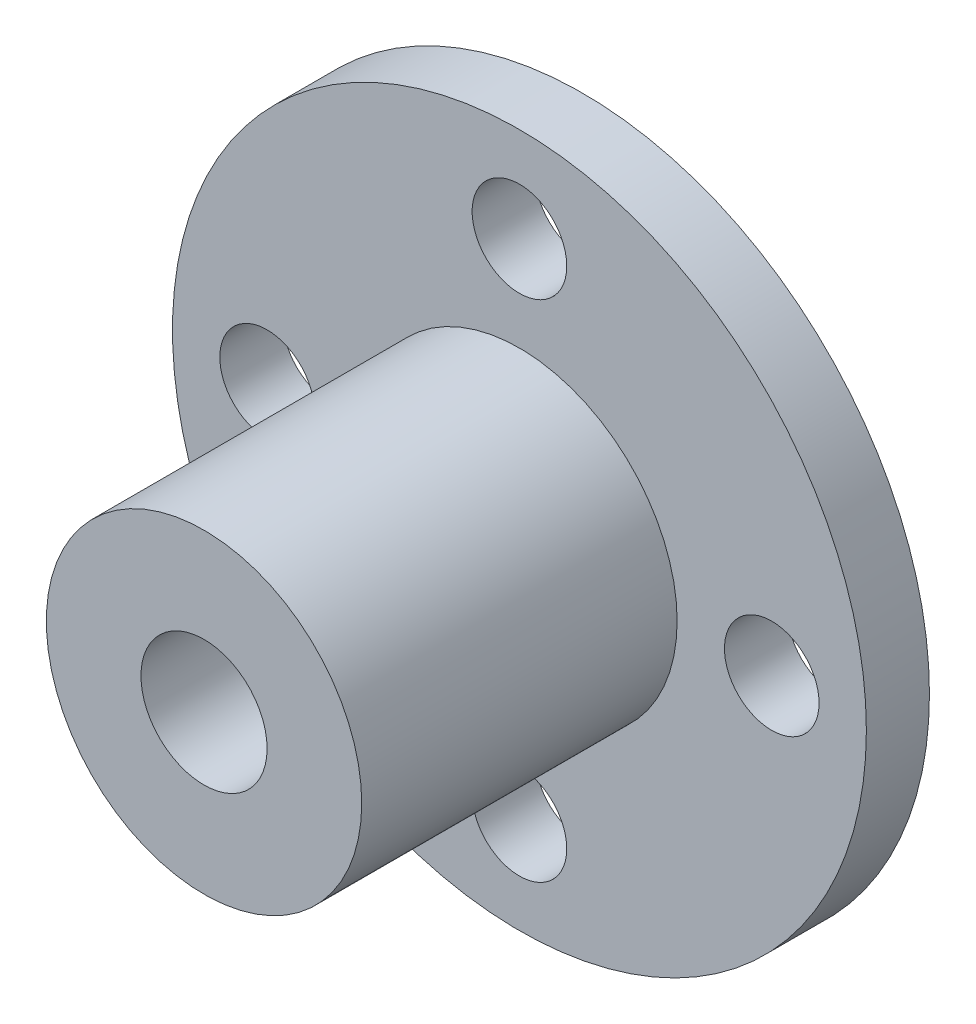
ISO-10303-21;
HEADER;
FILE_DESCRIPTION(('STEP AP214'),'2;1');
FILE_NAME('part.step','',(''),(''),'','','');
FILE_SCHEMA(('AUTOMOTIVE_DESIGN { 1 0 10303 214 1 1 1 1 }'));
ENDSEC;
DATA;
#1=APPLICATION_CONTEXT('core data for automotive mechanical design processes');
#2=APPLICATION_PROTOCOL_DEFINITION('international standard','automotive_design',2000,#1);
#3=PRODUCT_CONTEXT('',#1,'mechanical');
#4=PRODUCT('Part','Part','',(#3));
#5=PRODUCT_RELATED_PRODUCT_CATEGORY('part','',(#4));
#6=PRODUCT_DEFINITION_FORMATION('','',#4);
#7=PRODUCT_DEFINITION_CONTEXT('part definition',#1,'design');
#8=PRODUCT_DEFINITION('design','',#6,#7);
#9=PRODUCT_DEFINITION_SHAPE('','',#8);
#10=(LENGTH_UNIT() NAMED_UNIT(*) SI_UNIT(.MILLI.,.METRE.));
#11=(NAMED_UNIT(*) PLANE_ANGLE_UNIT() SI_UNIT($,.RADIAN.));
#12=(NAMED_UNIT(*) SI_UNIT($,.STERADIAN.) SOLID_ANGLE_UNIT());
#13=UNCERTAINTY_MEASURE_WITH_UNIT(LENGTH_MEASURE(1.E-05),#10,'distance_accuracy_value','');
#14=(GEOMETRIC_REPRESENTATION_CONTEXT(3) GLOBAL_UNCERTAINTY_ASSIGNED_CONTEXT((#13)) GLOBAL_UNIT_ASSIGNED_CONTEXT((#10,
#11,#12)) REPRESENTATION_CONTEXT('',''));
#15=CARTESIAN_POINT('',(0.,0.,0.));
#16=DIRECTION('',(0.,0.,1.));
#17=DIRECTION('',(1.,0.,0.));
#18=AXIS2_PLACEMENT_3D('',#15,#16,#17);
#19=CARTESIAN_POINT('',(0.,8.,2.));
#20=DIRECTION('',(0.,0.,-1.));
#21=DIRECTION('',(-1.,0.,0.));
#22=AXIS2_PLACEMENT_3D('',#19,#20,#21);
#23=CYLINDRICAL_SURFACE('',#22,1.5);
#24=CARTESIAN_POINT('',(0.,8.,2.));
#25=DIRECTION('',(0.,0.,1.));
#26=DIRECTION('',(1.,0.,0.));
#27=AXIS2_PLACEMENT_3D('',#24,#25,#26);
#28=CIRCLE('',#27,1.5);
#29=CARTESIAN_POINT('',(1.5,8.,2.));
#30=VERTEX_POINT('',#29);
#31=EDGE_CURVE('E47',#30,#30,#28,.T.);
#32=ORIENTED_EDGE('',*,*,#31,.T.);
#33=EDGE_LOOP('',(#32));
#34=FACE_BOUND('',#33,.T.);
#35=CARTESIAN_POINT('',(0.,8.,0.));
#36=DIRECTION('',(0.,0.,1.));
#37=DIRECTION('',(1.,0.,0.));
#38=AXIS2_PLACEMENT_3D('',#35,#36,#37);
#39=CIRCLE('',#38,1.5);
#40=CARTESIAN_POINT('',(1.5,8.,0.));
#41=VERTEX_POINT('',#40);
#42=EDGE_CURVE('E60',#41,#41,#39,.T.);
#43=ORIENTED_EDGE('',*,*,#42,.F.);
#44=EDGE_LOOP('',(#43));
#45=FACE_BOUND('',#44,.T.);
#46=ADVANCED_FACE('F34',(#34,#45),#23,.F.);
#47=CARTESIAN_POINT('',(8.,0.,2.));
#48=DIRECTION('',(0.,0.,-1.));
#49=DIRECTION('',(-1.,0.,0.));
#50=AXIS2_PLACEMENT_3D('',#47,#48,#49);
#51=CYLINDRICAL_SURFACE('',#50,1.5);
#52=CARTESIAN_POINT('',(8.,0.,2.));
#53=DIRECTION('',(0.,0.,1.));
#54=DIRECTION('',(1.,0.,0.));
#55=AXIS2_PLACEMENT_3D('',#52,#53,#54);
#56=CIRCLE('',#55,1.5);
#57=CARTESIAN_POINT('',(9.5,0.,2.));
#58=VERTEX_POINT('',#57);
#59=EDGE_CURVE('E74',#58,#58,#56,.T.);
#60=ORIENTED_EDGE('',*,*,#59,.T.);
#61=EDGE_LOOP('',(#60));
#62=FACE_BOUND('',#61,.T.);
#63=CARTESIAN_POINT('',(8.,0.,0.));
#64=DIRECTION('',(0.,0.,1.));
#65=DIRECTION('',(1.,0.,0.));
#66=AXIS2_PLACEMENT_3D('',#63,#64,#65);
#67=CIRCLE('',#66,1.5);
#68=CARTESIAN_POINT('',(9.5,0.,0.));
#69=VERTEX_POINT('',#68);
#70=EDGE_CURVE('E58',#69,#69,#67,.T.);
#71=ORIENTED_EDGE('',*,*,#70,.F.);
#72=EDGE_LOOP('',(#71));
#73=FACE_BOUND('',#72,.T.);
#74=ADVANCED_FACE('F121',(#62,#73),#51,.F.);
#75=CARTESIAN_POINT('',(0.,-8.,2.));
#76=DIRECTION('',(0.,0.,-1.));
#77=DIRECTION('',(-1.,0.,0.));
#78=AXIS2_PLACEMENT_3D('',#75,#76,#77);
#79=CYLINDRICAL_SURFACE('',#78,1.5);
#80=CARTESIAN_POINT('',(0.,-8.,2.));
#81=DIRECTION('',(0.,0.,1.));
#82=DIRECTION('',(1.,0.,0.));
#83=AXIS2_PLACEMENT_3D('',#80,#81,#82);
#84=CIRCLE('',#83,1.5);
#85=CARTESIAN_POINT('',(1.5,-8.,2.));
#86=VERTEX_POINT('',#85);
#87=EDGE_CURVE('E69',#86,#86,#84,.T.);
#88=ORIENTED_EDGE('',*,*,#87,.T.);
#89=EDGE_LOOP('',(#88));
#90=FACE_BOUND('',#89,.T.);
#91=CARTESIAN_POINT('',(0.,-8.,0.));
#92=DIRECTION('',(0.,0.,1.));
#93=DIRECTION('',(1.,0.,0.));
#94=AXIS2_PLACEMENT_3D('',#91,#92,#93);
#95=CIRCLE('',#94,1.5);
#96=CARTESIAN_POINT('',(1.5,-8.,0.));
#97=VERTEX_POINT('',#96);
#98=EDGE_CURVE('E54',#97,#97,#95,.T.);
#99=ORIENTED_EDGE('',*,*,#98,.F.);
#100=EDGE_LOOP('',(#99));
#101=FACE_BOUND('',#100,.T.);
#102=ADVANCED_FACE('F126',(#90,#101),#79,.F.);
#103=CARTESIAN_POINT('',(-8.,0.,2.));
#104=DIRECTION('',(0.,0.,-1.));
#105=DIRECTION('',(-1.,0.,0.));
#106=AXIS2_PLACEMENT_3D('',#103,#104,#105);
#107=CYLINDRICAL_SURFACE('',#106,1.5);
#108=CARTESIAN_POINT('',(-8.,0.,2.));
#109=DIRECTION('',(0.,0.,1.));
#110=DIRECTION('',(1.,0.,0.));
#111=AXIS2_PLACEMENT_3D('',#108,#109,#110);
#112=CIRCLE('',#111,1.5);
#113=CARTESIAN_POINT('',(-6.5,0.,2.));
#114=VERTEX_POINT('',#113);
#115=EDGE_CURVE('E65',#114,#114,#112,.T.);
#116=ORIENTED_EDGE('',*,*,#115,.T.);
#117=EDGE_LOOP('',(#116));
#118=FACE_BOUND('',#117,.T.);
#119=CARTESIAN_POINT('',(-8.,0.,0.));
#120=DIRECTION('',(0.,0.,1.));
#121=DIRECTION('',(1.,0.,0.));
#122=AXIS2_PLACEMENT_3D('',#119,#120,#121);
#123=CIRCLE('',#122,1.5);
#124=CARTESIAN_POINT('',(-6.5,0.,0.));
#125=VERTEX_POINT('',#124);
#126=EDGE_CURVE('E51',#125,#125,#123,.T.);
#127=ORIENTED_EDGE('',*,*,#126,.F.);
#128=EDGE_LOOP('',(#127));
#129=FACE_BOUND('',#128,.T.);
#130=ADVANCED_FACE('F36',(#118,#129),#107,.F.);
#131=CARTESIAN_POINT('',(0.,0.,2.));
#132=DIRECTION('',(0.,0.,-1.));
#133=DIRECTION('',(-1.,0.,0.));
#134=AXIS2_PLACEMENT_3D('',#131,#132,#133);
#135=CYLINDRICAL_SURFACE('',#134,11.);
#136=CARTESIAN_POINT('',(0.,0.,2.));
#137=DIRECTION('',(0.,0.,1.));
#138=DIRECTION('',(1.,0.,0.));
#139=AXIS2_PLACEMENT_3D('',#136,#137,#138);
#140=CIRCLE('',#139,11.);
#141=CARTESIAN_POINT('',(11.,0.,2.));
#142=VERTEX_POINT('',#141);
#143=EDGE_CURVE('E10',#142,#142,#140,.T.);
#144=ORIENTED_EDGE('',*,*,#143,.F.);
#145=EDGE_LOOP('',(#144));
#146=FACE_BOUND('',#145,.T.);
#147=CARTESIAN_POINT('',(0.,0.,0.));
#148=DIRECTION('',(0.,0.,1.));
#149=DIRECTION('',(1.,0.,0.));
#150=AXIS2_PLACEMENT_3D('',#147,#148,#149);
#151=CIRCLE('',#150,11.);
#152=CARTESIAN_POINT('',(11.,0.,0.));
#153=VERTEX_POINT('',#152);
#154=EDGE_CURVE('E38',#153,#153,#151,.T.);
#155=ORIENTED_EDGE('',*,*,#154,.T.);
#156=EDGE_LOOP('',(#155));
#157=FACE_BOUND('',#156,.T.);
#158=ADVANCED_FACE('F90',(#146,#157),#135,.T.);
#159=CARTESIAN_POINT('',(0.,0.,2.));
#160=DIRECTION('',(0.,0.,1.));
#161=DIRECTION('',(1.,0.,0.));
#162=AXIS2_PLACEMENT_3D('',#159,#160,#161);
#163=PLANE('',#162);
#164=ORIENTED_EDGE('',*,*,#115,.F.);
#165=EDGE_LOOP('',(#164));
#166=FACE_BOUND('',#165,.T.);
#167=ORIENTED_EDGE('',*,*,#87,.F.);
#168=EDGE_LOOP('',(#167));
#169=FACE_BOUND('',#168,.T.);
#170=ORIENTED_EDGE('',*,*,#59,.F.);
#171=EDGE_LOOP('',(#170));
#172=FACE_BOUND('',#171,.T.);
#173=ORIENTED_EDGE('',*,*,#31,.F.);
#174=EDGE_LOOP('',(#173));
#175=FACE_BOUND('',#174,.T.);
#176=CARTESIAN_POINT('',(0.,0.,2.));
#177=DIRECTION('',(0.,0.,1.));
#178=DIRECTION('',(1.,0.,0.));
#179=AXIS2_PLACEMENT_3D('',#176,#177,#178);
#180=CIRCLE('',#179,5.);
#181=CARTESIAN_POINT('',(5.,0.,2.));
#182=VERTEX_POINT('',#181);
#183=EDGE_CURVE('E42',#182,#182,#180,.T.);
#184=ORIENTED_EDGE('',*,*,#183,.F.);
#185=EDGE_LOOP('',(#184));
#186=FACE_BOUND('',#185,.T.);
#187=ORIENTED_EDGE('',*,*,#143,.T.);
#188=EDGE_LOOP('',(#187));
#189=FACE_BOUND('',#188,.T.);
#190=ADVANCED_FACE('F86',(#166,#169,#172,#175,#186,#189),#163,.T.);
#191=CARTESIAN_POINT('',(0.,0.,0.));
#192=DIRECTION('',(0.,0.,1.));
#193=DIRECTION('',(1.,0.,0.));
#194=AXIS2_PLACEMENT_3D('',#191,#192,#193);
#195=PLANE('',#194);
#196=ORIENTED_EDGE('',*,*,#126,.T.);
#197=EDGE_LOOP('',(#196));
#198=FACE_BOUND('',#197,.T.);
#199=ORIENTED_EDGE('',*,*,#98,.T.);
#200=EDGE_LOOP('',(#199));
#201=FACE_BOUND('',#200,.T.);
#202=ORIENTED_EDGE('',*,*,#70,.T.);
#203=EDGE_LOOP('',(#202));
#204=FACE_BOUND('',#203,.T.);
#205=ORIENTED_EDGE('',*,*,#42,.T.);
#206=EDGE_LOOP('',(#205));
#207=FACE_BOUND('',#206,.T.);
#208=ORIENTED_EDGE('',*,*,#154,.F.);
#209=EDGE_LOOP('',(#208));
#210=FACE_BOUND('',#209,.T.);
#211=CARTESIAN_POINT('',(0.,0.,0.));
#212=DIRECTION('',(0.,0.,1.));
#213=DIRECTION('',(1.,0.,0.));
#214=AXIS2_PLACEMENT_3D('',#211,#212,#213);
#215=CIRCLE('',#214,2.);
#216=CARTESIAN_POINT('',(2.,0.,0.));
#217=VERTEX_POINT('',#216);
#218=EDGE_CURVE('E77',#217,#217,#215,.T.);
#219=ORIENTED_EDGE('',*,*,#218,.T.);
#220=EDGE_LOOP('',(#219));
#221=FACE_BOUND('',#220,.T.);
#222=ADVANCED_FACE('F89',(#198,#201,#204,#207,#210,#221),#195,.F.);
#223=CARTESIAN_POINT('',(0.,0.,12.));
#224=DIRECTION('',(0.,0.,-1.));
#225=DIRECTION('',(-1.,0.,0.));
#226=AXIS2_PLACEMENT_3D('',#223,#224,#225);
#227=CYLINDRICAL_SURFACE('',#226,2.);
#228=CARTESIAN_POINT('',(0.,0.,12.));
#229=DIRECTION('',(0.,0.,1.));
#230=DIRECTION('',(1.,0.,0.));
#231=AXIS2_PLACEMENT_3D('',#228,#229,#230);
#232=CIRCLE('',#231,2.);
#233=CARTESIAN_POINT('',(2.,0.,12.));
#234=VERTEX_POINT('',#233);
#235=EDGE_CURVE('E104',#234,#234,#232,.T.);
#236=ORIENTED_EDGE('',*,*,#235,.T.);
#237=EDGE_LOOP('',(#236));
#238=FACE_BOUND('',#237,.T.);
#239=ORIENTED_EDGE('',*,*,#218,.F.);
#240=EDGE_LOOP('',(#239));
#241=FACE_BOUND('',#240,.T.);
#242=ADVANCED_FACE('F99',(#238,#241),#227,.F.);
#243=CARTESIAN_POINT('',(0.,0.,12.));
#244=DIRECTION('',(0.,0.,-1.));
#245=DIRECTION('',(-1.,0.,0.));
#246=AXIS2_PLACEMENT_3D('',#243,#244,#245);
#247=CYLINDRICAL_SURFACE('',#246,5.);
#248=ORIENTED_EDGE('',*,*,#183,.T.);
#249=EDGE_LOOP('',(#248));
#250=FACE_BOUND('',#249,.T.);
#251=CARTESIAN_POINT('',(0.,0.,12.));
#252=DIRECTION('',(0.,0.,1.));
#253=DIRECTION('',(1.,0.,0.));
#254=AXIS2_PLACEMENT_3D('',#251,#252,#253);
#255=CIRCLE('',#254,5.);
#256=CARTESIAN_POINT('',(5.,0.,12.));
#257=VERTEX_POINT('',#256);
#258=EDGE_CURVE('E55',#257,#257,#255,.T.);
#259=ORIENTED_EDGE('',*,*,#258,.F.);
#260=EDGE_LOOP('',(#259));
#261=FACE_BOUND('',#260,.T.);
#262=ADVANCED_FACE('F95',(#250,#261),#247,.T.);
#263=CARTESIAN_POINT('',(0.,0.,12.));
#264=DIRECTION('',(0.,0.,1.));
#265=DIRECTION('',(1.,0.,0.));
#266=AXIS2_PLACEMENT_3D('',#263,#264,#265);
#267=PLANE('',#266);
#268=ORIENTED_EDGE('',*,*,#235,.F.);
#269=EDGE_LOOP('',(#268));
#270=FACE_BOUND('',#269,.T.);
#271=ORIENTED_EDGE('',*,*,#258,.T.);
#272=EDGE_LOOP('',(#271));
#273=FACE_BOUND('',#272,.T.);
#274=ADVANCED_FACE('F98',(#270,#273),#267,.T.);
#275=CLOSED_SHELL('',(#46,#74,#102,#130,#158,#190,#222,#242,#262,#274));
#276=MANIFOLD_SOLID_BREP('B2',#275);
#277=ADVANCED_BREP_SHAPE_REPRESENTATION('',(#18,#276),#14);
#278=SHAPE_DEFINITION_REPRESENTATION(#9,#277);
ENDSEC;
END-ISO-10303-21;
